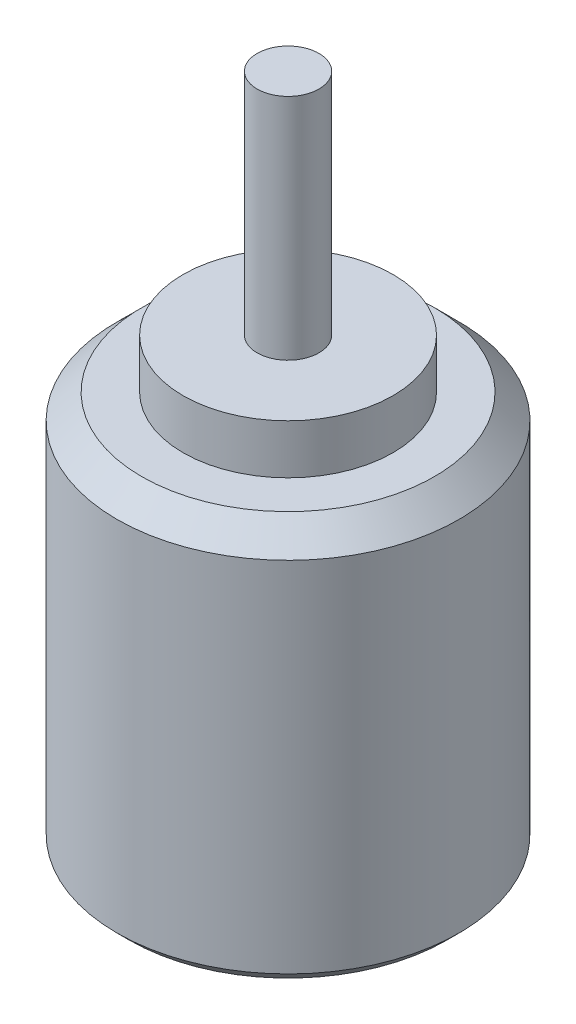
ISO-10303-21;
HEADER;
FILE_DESCRIPTION(('STEP AP214'),'2;1');
FILE_NAME('part.step','',(''),(''),'','','');
FILE_SCHEMA(('AUTOMOTIVE_DESIGN { 1 0 10303 214 1 1 1 1 }'));
ENDSEC;
DATA;
#1=APPLICATION_CONTEXT('core data for automotive mechanical design processes');
#2=APPLICATION_PROTOCOL_DEFINITION('international standard','automotive_design',2000,#1);
#3=PRODUCT_CONTEXT('',#1,'mechanical');
#4=PRODUCT('Part','Part','',(#3));
#5=PRODUCT_RELATED_PRODUCT_CATEGORY('part','',(#4));
#6=PRODUCT_DEFINITION_FORMATION('','',#4);
#7=PRODUCT_DEFINITION_CONTEXT('part definition',#1,'design');
#8=PRODUCT_DEFINITION('design','',#6,#7);
#9=PRODUCT_DEFINITION_SHAPE('','',#8);
#10=(LENGTH_UNIT() NAMED_UNIT(*) SI_UNIT(.MILLI.,.METRE.));
#11=(NAMED_UNIT(*) PLANE_ANGLE_UNIT() SI_UNIT($,.RADIAN.));
#12=(NAMED_UNIT(*) SI_UNIT($,.STERADIAN.) SOLID_ANGLE_UNIT());
#13=UNCERTAINTY_MEASURE_WITH_UNIT(LENGTH_MEASURE(1.E-05),#10,'distance_accuracy_value','');
#14=(GEOMETRIC_REPRESENTATION_CONTEXT(3) GLOBAL_UNCERTAINTY_ASSIGNED_CONTEXT((#13)) GLOBAL_UNIT_ASSIGNED_CONTEXT((#10,
#11,#12)) REPRESENTATION_CONTEXT('',''));
#15=CARTESIAN_POINT('',(0.,0.,0.));
#16=DIRECTION('',(0.,0.,1.));
#17=DIRECTION('',(1.,0.,0.));
#18=AXIS2_PLACEMENT_3D('',#15,#16,#17);
#19=CARTESIAN_POINT('',(0.,32.,0.));
#20=DIRECTION('',(0.,-1.,0.));
#21=DIRECTION('',(0.,0.,-1.));
#22=AXIS2_PLACEMENT_3D('',#19,#20,#21);
#23=CYLINDRICAL_SURFACE('',#22,13.85);
#24=CARTESIAN_POINT('',(0.,0.999999999999987,0.));
#25=DIRECTION('',(0.,1.,0.));
#26=DIRECTION('',(0.,0.,1.));
#27=AXIS2_PLACEMENT_3D('',#24,#25,#26);
#28=CIRCLE('',#27,13.85);
#29=CARTESIAN_POINT('',(0.,0.999999999999987,13.85));
#30=VERTEX_POINT('',#29);
#31=EDGE_CURVE('E43',#30,#30,#28,.T.);
#32=ORIENTED_EDGE('',*,*,#31,.T.);
#33=EDGE_LOOP('',(#32));
#34=FACE_BOUND('',#33,.T.);
#35=CARTESIAN_POINT('',(0.,30.,0.));
#36=DIRECTION('',(0.,1.,0.));
#37=DIRECTION('',(0.,0.,1.));
#38=AXIS2_PLACEMENT_3D('',#35,#36,#37);
#39=CIRCLE('',#38,13.85);
#40=CARTESIAN_POINT('',(0.,30.,13.85));
#41=VERTEX_POINT('',#40);
#42=EDGE_CURVE('E47',#41,#41,#39,.F.);
#43=ORIENTED_EDGE('',*,*,#42,.T.);
#44=EDGE_LOOP('',(#43));
#45=FACE_BOUND('',#44,.T.);
#46=ADVANCED_FACE('F36',(#34,#45),#23,.T.);
#47=CARTESIAN_POINT('',(0.,32.,0.));
#48=DIRECTION('',(0.,1.,0.));
#49=DIRECTION('',(0.,0.,1.));
#50=AXIS2_PLACEMENT_3D('',#47,#48,#49);
#51=PLANE('',#50);
#52=CARTESIAN_POINT('',(0.,32.,0.));
#53=DIRECTION('',(0.,1.,0.));
#54=DIRECTION('',(0.,0.,1.));
#55=AXIS2_PLACEMENT_3D('',#52,#53,#54);
#56=CIRCLE('',#55,11.85);
#57=CARTESIAN_POINT('',(0.,32.,11.85));
#58=VERTEX_POINT('',#57);
#59=EDGE_CURVE('E51',#58,#58,#56,.T.);
#60=ORIENTED_EDGE('',*,*,#59,.T.);
#61=EDGE_LOOP('',(#60));
#62=FACE_BOUND('',#61,.T.);
#63=CARTESIAN_POINT('',(0.,32.,0.));
#64=DIRECTION('',(0.,1.,0.));
#65=DIRECTION('',(0.,0.,1.));
#66=AXIS2_PLACEMENT_3D('',#63,#64,#65);
#67=CIRCLE('',#66,8.5);
#68=CARTESIAN_POINT('',(0.,32.,8.5));
#69=VERTEX_POINT('',#68);
#70=EDGE_CURVE('E60',#69,#69,#67,.T.);
#71=ORIENTED_EDGE('',*,*,#70,.F.);
#72=EDGE_LOOP('',(#71));
#73=FACE_BOUND('',#72,.T.);
#74=ADVANCED_FACE('F112',(#62,#73),#51,.T.);
#75=CARTESIAN_POINT('',(0.,0.,0.));
#76=DIRECTION('',(0.,1.,0.));
#77=DIRECTION('',(0.,0.,1.));
#78=AXIS2_PLACEMENT_3D('',#75,#76,#77);
#79=PLANE('',#78);
#80=CARTESIAN_POINT('',(0.,0.,8.));
#81=DIRECTION('',(0.,-1.,0.));
#82=DIRECTION('',(0.,0.,-1.));
#83=AXIS2_PLACEMENT_3D('',#80,#81,#82);
#84=CIRCLE('',#83,1.35);
#85=CARTESIAN_POINT('',(0.,0.,6.65));
#86=VERTEX_POINT('',#85);
#87=EDGE_CURVE('E93',#86,#86,#84,.T.);
#88=ORIENTED_EDGE('',*,*,#87,.F.);
#89=EDGE_LOOP('',(#88));
#90=FACE_BOUND('',#89,.T.);
#91=CARTESIAN_POINT('',(-9.5,0.,0.));
#92=DIRECTION('',(0.,-1.,0.));
#93=DIRECTION('',(0.,0.,-1.));
#94=AXIS2_PLACEMENT_3D('',#91,#92,#93);
#95=CIRCLE('',#94,1.35);
#96=CARTESIAN_POINT('',(-9.5,0.,-1.35));
#97=VERTEX_POINT('',#96);
#98=EDGE_CURVE('E87',#97,#97,#95,.T.);
#99=ORIENTED_EDGE('',*,*,#98,.F.);
#100=EDGE_LOOP('',(#99));
#101=FACE_BOUND('',#100,.T.);
#102=CARTESIAN_POINT('',(0.,0.,-8.));
#103=DIRECTION('',(0.,-1.,0.));
#104=DIRECTION('',(0.,0.,-1.));
#105=AXIS2_PLACEMENT_3D('',#102,#103,#104);
#106=CIRCLE('',#105,1.35);
#107=CARTESIAN_POINT('',(0.,0.,-9.35));
#108=VERTEX_POINT('',#107);
#109=EDGE_CURVE('E81',#108,#108,#106,.T.);
#110=ORIENTED_EDGE('',*,*,#109,.F.);
#111=EDGE_LOOP('',(#110));
#112=FACE_BOUND('',#111,.T.);
#113=CARTESIAN_POINT('',(9.5,0.,0.));
#114=DIRECTION('',(0.,-1.,0.));
#115=DIRECTION('',(0.,0.,-1.));
#116=AXIS2_PLACEMENT_3D('',#113,#114,#115);
#117=CIRCLE('',#116,1.35);
#118=CARTESIAN_POINT('',(9.5,0.,-1.35));
#119=VERTEX_POINT('',#118);
#120=EDGE_CURVE('E75',#119,#119,#117,.T.);
#121=ORIENTED_EDGE('',*,*,#120,.F.);
#122=EDGE_LOOP('',(#121));
#123=FACE_BOUND('',#122,.T.);
#124=CARTESIAN_POINT('',(0.,0.,0.));
#125=DIRECTION('',(0.,1.,0.));
#126=DIRECTION('',(0.,0.,1.));
#127=AXIS2_PLACEMENT_3D('',#124,#125,#126);
#128=CIRCLE('',#127,12.85);
#129=CARTESIAN_POINT('',(0.,0.,12.85));
#130=VERTEX_POINT('',#129);
#131=EDGE_CURVE('E10',#130,#130,#128,.F.);
#132=ORIENTED_EDGE('',*,*,#131,.T.);
#133=EDGE_LOOP('',(#132));
#134=FACE_BOUND('',#133,.T.);
#135=CARTESIAN_POINT('',(0.,0.,0.));
#136=DIRECTION('',(0.,-1.,0.));
#137=DIRECTION('',(0.,0.,-1.));
#138=AXIS2_PLACEMENT_3D('',#135,#136,#137);
#139=CIRCLE('',#138,2.5);
#140=CARTESIAN_POINT('',(0.,0.,-2.5));
#141=VERTEX_POINT('',#140);
#142=EDGE_CURVE('E57',#141,#141,#139,.T.);
#143=ORIENTED_EDGE('',*,*,#142,.F.);
#144=EDGE_LOOP('',(#143));
#145=FACE_BOUND('',#144,.T.);
#146=ADVANCED_FACE('F108',(#90,#101,#112,#123,#134,#145),#79,.F.);
#147=CARTESIAN_POINT('',(0.,-2.5,0.));
#148=DIRECTION('',(0.,1.,0.));
#149=DIRECTION('',(0.,0.,1.));
#150=AXIS2_PLACEMENT_3D('',#147,#148,#149);
#151=CYLINDRICAL_SURFACE('',#150,2.5);
#152=CARTESIAN_POINT('',(0.,-2.5,0.));
#153=DIRECTION('',(0.,-1.,0.));
#154=DIRECTION('',(0.,0.,-1.));
#155=AXIS2_PLACEMENT_3D('',#152,#153,#154);
#156=CIRCLE('',#155,2.5);
#157=CARTESIAN_POINT('',(0.,-2.5,-2.5));
#158=VERTEX_POINT('',#157);
#159=EDGE_CURVE('E61',#158,#158,#156,.T.);
#160=ORIENTED_EDGE('',*,*,#159,.F.);
#161=EDGE_LOOP('',(#160));
#162=FACE_BOUND('',#161,.T.);
#163=ORIENTED_EDGE('',*,*,#142,.T.);
#164=EDGE_LOOP('',(#163));
#165=FACE_BOUND('',#164,.T.);
#166=ADVANCED_FACE('F111',(#162,#165),#151,.T.);
#167=CARTESIAN_POINT('',(0.,-2.5,0.));
#168=DIRECTION('',(0.,-1.,0.));
#169=DIRECTION('',(0.,0.,-1.));
#170=AXIS2_PLACEMENT_3D('',#167,#168,#169);
#171=PLANE('',#170);
#172=ORIENTED_EDGE('',*,*,#159,.T.);
#173=EDGE_LOOP('',(#172));
#174=FACE_BOUND('',#173,.T.);
#175=ADVANCED_FACE('F123',(#174),#171,.T.);
#176=CARTESIAN_POINT('',(0.,36.,0.));
#177=DIRECTION('',(0.,-1.,0.));
#178=DIRECTION('',(0.,0.,-1.));
#179=AXIS2_PLACEMENT_3D('',#176,#177,#178);
#180=CYLINDRICAL_SURFACE('',#179,8.5);
#181=CARTESIAN_POINT('',(0.,36.,0.));
#182=DIRECTION('',(0.,1.,0.));
#183=DIRECTION('',(0.,0.,1.));
#184=AXIS2_PLACEMENT_3D('',#181,#182,#183);
#185=CIRCLE('',#184,8.5);
#186=CARTESIAN_POINT('',(0.,36.,8.5));
#187=VERTEX_POINT('',#186);
#188=EDGE_CURVE('E64',#187,#187,#185,.T.);
#189=ORIENTED_EDGE('',*,*,#188,.F.);
#190=EDGE_LOOP('',(#189));
#191=FACE_BOUND('',#190,.T.);
#192=ORIENTED_EDGE('',*,*,#70,.T.);
#193=EDGE_LOOP('',(#192));
#194=FACE_BOUND('',#193,.T.);
#195=ADVANCED_FACE('F129',(#191,#194),#180,.T.);
#196=CARTESIAN_POINT('',(0.,36.,0.));
#197=DIRECTION('',(0.,1.,0.));
#198=DIRECTION('',(0.,0.,1.));
#199=AXIS2_PLACEMENT_3D('',#196,#197,#198);
#200=PLANE('',#199);
#201=CARTESIAN_POINT('',(0.,36.,0.));
#202=DIRECTION('',(0.,1.,0.));
#203=DIRECTION('',(0.,0.,1.));
#204=AXIS2_PLACEMENT_3D('',#201,#202,#203);
#205=CIRCLE('',#204,2.5);
#206=CARTESIAN_POINT('',(0.,36.,2.5));
#207=VERTEX_POINT('',#206);
#208=EDGE_CURVE('E56',#207,#207,#205,.T.);
#209=ORIENTED_EDGE('',*,*,#208,.F.);
#210=EDGE_LOOP('',(#209));
#211=FACE_BOUND('',#210,.T.);
#212=ORIENTED_EDGE('',*,*,#188,.T.);
#213=EDGE_LOOP('',(#212));
#214=FACE_BOUND('',#213,.T.);
#215=ADVANCED_FACE('F161',(#211,#214),#200,.T.);
#216=CARTESIAN_POINT('',(0.,54.5,0.));
#217=DIRECTION('',(0.,-1.,0.));
#218=DIRECTION('',(0.,0.,-1.));
#219=AXIS2_PLACEMENT_3D('',#216,#217,#218);
#220=CYLINDRICAL_SURFACE('',#219,2.5);
#221=CARTESIAN_POINT('',(0.,54.5,0.));
#222=DIRECTION('',(0.,1.,0.));
#223=DIRECTION('',(0.,0.,1.));
#224=AXIS2_PLACEMENT_3D('',#221,#222,#223);
#225=CIRCLE('',#224,2.5);
#226=CARTESIAN_POINT('',(0.,54.5,2.5));
#227=VERTEX_POINT('',#226);
#228=EDGE_CURVE('E69',#227,#227,#225,.T.);
#229=ORIENTED_EDGE('',*,*,#228,.F.);
#230=EDGE_LOOP('',(#229));
#231=FACE_BOUND('',#230,.T.);
#232=ORIENTED_EDGE('',*,*,#208,.T.);
#233=EDGE_LOOP('',(#232));
#234=FACE_BOUND('',#233,.T.);
#235=ADVANCED_FACE('F151',(#231,#234),#220,.T.);
#236=CARTESIAN_POINT('',(0.,54.5,0.));
#237=DIRECTION('',(0.,1.,0.));
#238=DIRECTION('',(0.,0.,1.));
#239=AXIS2_PLACEMENT_3D('',#236,#237,#238);
#240=PLANE('',#239);
#241=ORIENTED_EDGE('',*,*,#228,.T.);
#242=EDGE_LOOP('',(#241));
#243=FACE_BOUND('',#242,.T.);
#244=ADVANCED_FACE('F143',(#243),#240,.T.);
#245=CARTESIAN_POINT('',(0.,32.,0.));
#246=DIRECTION('',(0.,-1.,0.));
#247=DIRECTION('',(0.,0.,-1.));
#248=AXIS2_PLACEMENT_3D('',#245,#246,#247);
#249=CONICAL_SURFACE('',#248,11.85,0.785398163397443);
#250=ORIENTED_EDGE('',*,*,#42,.F.);
#251=EDGE_LOOP('',(#250));
#252=FACE_BOUND('',#251,.T.);
#253=ORIENTED_EDGE('',*,*,#59,.F.);
#254=EDGE_LOOP('',(#253));
#255=FACE_BOUND('',#254,.T.);
#256=ADVANCED_FACE('F141',(#252,#255),#249,.T.);
#257=CARTESIAN_POINT('',(0.,0.999999999999987,0.));
#258=DIRECTION('',(0.,1.,0.));
#259=DIRECTION('',(0.,0.,1.));
#260=AXIS2_PLACEMENT_3D('',#257,#258,#259);
#261=CONICAL_SURFACE('',#260,13.85,0.78539816339745);
#262=ORIENTED_EDGE('',*,*,#131,.F.);
#263=EDGE_LOOP('',(#262));
#264=FACE_BOUND('',#263,.T.);
#265=ORIENTED_EDGE('',*,*,#31,.F.);
#266=EDGE_LOOP('',(#265));
#267=FACE_BOUND('',#266,.T.);
#268=ADVANCED_FACE('F38',(#264,#267),#261,.T.);
#269=CARTESIAN_POINT('',(9.5,3.,0.));
#270=DIRECTION('',(0.,-1.,0.));
#271=DIRECTION('',(0.,0.,-1.));
#272=AXIS2_PLACEMENT_3D('',#269,#270,#271);
#273=CYLINDRICAL_SURFACE('',#272,1.35);
#274=CARTESIAN_POINT('',(9.5,3.,0.));
#275=DIRECTION('',(0.,-1.,0.));
#276=DIRECTION('',(0.,0.,-1.));
#277=AXIS2_PLACEMENT_3D('',#274,#275,#276);
#278=CIRCLE('',#277,1.35);
#279=CARTESIAN_POINT('',(9.5,3.,-1.35));
#280=VERTEX_POINT('',#279);
#281=EDGE_CURVE('E78',#280,#280,#278,.T.);
#282=ORIENTED_EDGE('',*,*,#281,.F.);
#283=EDGE_LOOP('',(#282));
#284=FACE_BOUND('',#283,.T.);
#285=ORIENTED_EDGE('',*,*,#120,.T.);
#286=EDGE_LOOP('',(#285));
#287=FACE_BOUND('',#286,.T.);
#288=ADVANCED_FACE('F149',(#284,#287),#273,.F.);
#289=CARTESIAN_POINT('',(9.5,3.,0.));
#290=DIRECTION('',(0.,-1.,0.));
#291=DIRECTION('',(0.,0.,-1.));
#292=AXIS2_PLACEMENT_3D('',#289,#290,#291);
#293=PLANE('',#292);
#294=ORIENTED_EDGE('',*,*,#281,.T.);
#295=EDGE_LOOP('',(#294));
#296=FACE_BOUND('',#295,.T.);
#297=ADVANCED_FACE('F176',(#296),#293,.T.);
#298=CARTESIAN_POINT('',(0.,3.,-8.));
#299=DIRECTION('',(0.,-1.,0.));
#300=DIRECTION('',(0.,0.,-1.));
#301=AXIS2_PLACEMENT_3D('',#298,#299,#300);
#302=CYLINDRICAL_SURFACE('',#301,1.35);
#303=CARTESIAN_POINT('',(0.,3.,-8.));
#304=DIRECTION('',(0.,-1.,0.));
#305=DIRECTION('',(0.,0.,-1.));
#306=AXIS2_PLACEMENT_3D('',#303,#304,#305);
#307=CIRCLE('',#306,1.35);
#308=CARTESIAN_POINT('',(0.,3.,-9.35));
#309=VERTEX_POINT('',#308);
#310=EDGE_CURVE('E84',#309,#309,#307,.T.);
#311=ORIENTED_EDGE('',*,*,#310,.F.);
#312=EDGE_LOOP('',(#311));
#313=FACE_BOUND('',#312,.T.);
#314=ORIENTED_EDGE('',*,*,#109,.T.);
#315=EDGE_LOOP('',(#314));
#316=FACE_BOUND('',#315,.T.);
#317=ADVANCED_FACE('F180',(#313,#316),#302,.F.);
#318=CARTESIAN_POINT('',(0.,3.,-8.));
#319=DIRECTION('',(0.,-1.,0.));
#320=DIRECTION('',(0.,0.,-1.));
#321=AXIS2_PLACEMENT_3D('',#318,#319,#320);
#322=PLANE('',#321);
#323=ORIENTED_EDGE('',*,*,#310,.T.);
#324=EDGE_LOOP('',(#323));
#325=FACE_BOUND('',#324,.T.);
#326=ADVANCED_FACE('F184',(#325),#322,.T.);
#327=CARTESIAN_POINT('',(-9.5,3.,0.));
#328=DIRECTION('',(0.,-1.,0.));
#329=DIRECTION('',(0.,0.,-1.));
#330=AXIS2_PLACEMENT_3D('',#327,#328,#329);
#331=CYLINDRICAL_SURFACE('',#330,1.35);
#332=CARTESIAN_POINT('',(-9.5,3.,0.));
#333=DIRECTION('',(0.,-1.,0.));
#334=DIRECTION('',(0.,0.,-1.));
#335=AXIS2_PLACEMENT_3D('',#332,#333,#334);
#336=CIRCLE('',#335,1.35);
#337=CARTESIAN_POINT('',(-9.5,3.,-1.35));
#338=VERTEX_POINT('',#337);
#339=EDGE_CURVE('E90',#338,#338,#336,.T.);
#340=ORIENTED_EDGE('',*,*,#339,.F.);
#341=EDGE_LOOP('',(#340));
#342=FACE_BOUND('',#341,.T.);
#343=ORIENTED_EDGE('',*,*,#98,.T.);
#344=EDGE_LOOP('',(#343));
#345=FACE_BOUND('',#344,.T.);
#346=ADVANCED_FACE('F188',(#342,#345),#331,.F.);
#347=CARTESIAN_POINT('',(-9.5,3.,0.));
#348=DIRECTION('',(0.,-1.,0.));
#349=DIRECTION('',(0.,0.,-1.));
#350=AXIS2_PLACEMENT_3D('',#347,#348,#349);
#351=PLANE('',#350);
#352=ORIENTED_EDGE('',*,*,#339,.T.);
#353=EDGE_LOOP('',(#352));
#354=FACE_BOUND('',#353,.T.);
#355=ADVANCED_FACE('F104',(#354),#351,.T.);
#356=CARTESIAN_POINT('',(0.,3.,8.));
#357=DIRECTION('',(0.,-1.,0.));
#358=DIRECTION('',(0.,0.,-1.));
#359=AXIS2_PLACEMENT_3D('',#356,#357,#358);
#360=CYLINDRICAL_SURFACE('',#359,1.35);
#361=CARTESIAN_POINT('',(0.,3.,8.));
#362=DIRECTION('',(0.,-1.,0.));
#363=DIRECTION('',(0.,0.,-1.));
#364=AXIS2_PLACEMENT_3D('',#361,#362,#363);
#365=CIRCLE('',#364,1.35);
#366=CARTESIAN_POINT('',(0.,3.,6.65));
#367=VERTEX_POINT('',#366);
#368=EDGE_CURVE('E74',#367,#367,#365,.T.);
#369=ORIENTED_EDGE('',*,*,#368,.F.);
#370=EDGE_LOOP('',(#369));
#371=FACE_BOUND('',#370,.T.);
#372=ORIENTED_EDGE('',*,*,#87,.T.);
#373=EDGE_LOOP('',(#372));
#374=FACE_BOUND('',#373,.T.);
#375=ADVANCED_FACE('F101',(#371,#374),#360,.F.);
#376=CARTESIAN_POINT('',(0.,3.,8.));
#377=DIRECTION('',(0.,-1.,0.));
#378=DIRECTION('',(0.,0.,-1.));
#379=AXIS2_PLACEMENT_3D('',#376,#377,#378);
#380=PLANE('',#379);
#381=ORIENTED_EDGE('',*,*,#368,.T.);
#382=EDGE_LOOP('',(#381));
#383=FACE_BOUND('',#382,.T.);
#384=ADVANCED_FACE('F99',(#383),#380,.T.);
#385=CLOSED_SHELL('',(#46,#74,#146,#166,#175,#195,#215,#235,#244,#256,#268,#288,#297,#317,#326,
#346,#355,#375,#384));
#386=MANIFOLD_SOLID_BREP('B2',#385);
#387=ADVANCED_BREP_SHAPE_REPRESENTATION('',(#18,#386),#14);
#388=SHAPE_DEFINITION_REPRESENTATION(#9,#387);
ENDSEC;
END-ISO-10303-21;
